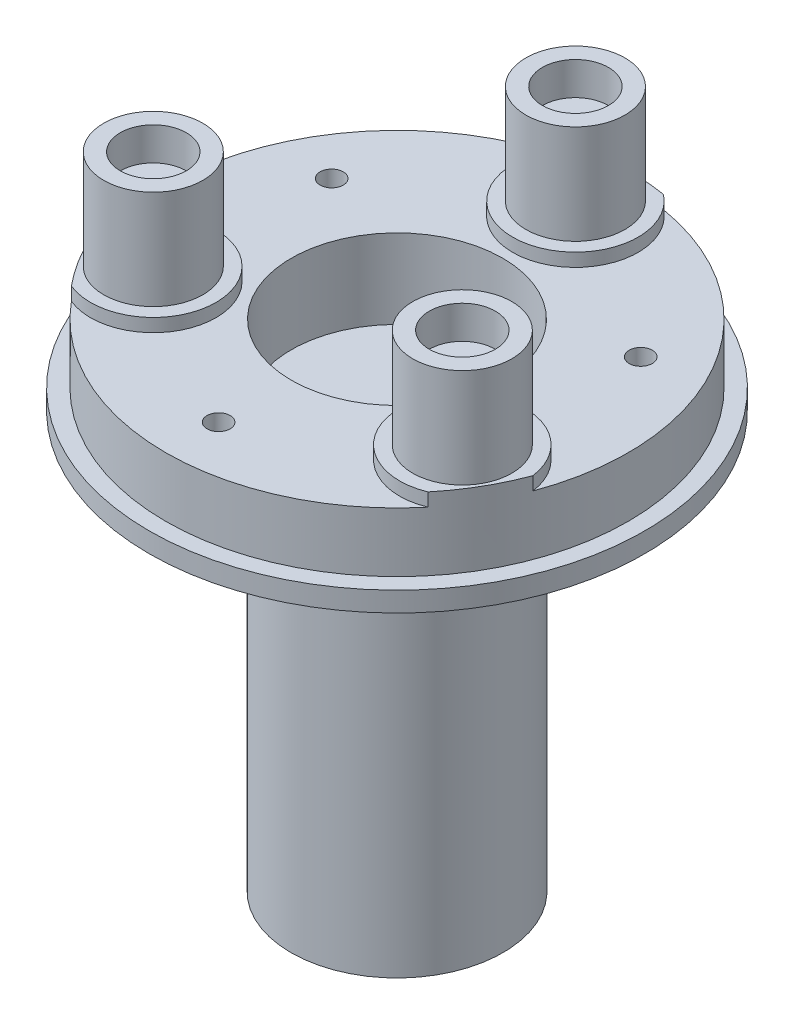
ISO-10303-21;
HEADER;
FILE_DESCRIPTION(('STEP AP214'),'2;1');
FILE_NAME('part.step','',(''),(''),'','','');
FILE_SCHEMA(('AUTOMOTIVE_DESIGN { 1 0 10303 214 1 1 1 1 }'));
ENDSEC;
DATA;
#1=APPLICATION_CONTEXT('core data for automotive mechanical design processes');
#2=APPLICATION_PROTOCOL_DEFINITION('international standard','automotive_design',2000,#1);
#3=PRODUCT_CONTEXT('',#1,'mechanical');
#4=PRODUCT('Part','Part','',(#3));
#5=PRODUCT_RELATED_PRODUCT_CATEGORY('part','',(#4));
#6=PRODUCT_DEFINITION_FORMATION('','',#4);
#7=PRODUCT_DEFINITION_CONTEXT('part definition',#1,'design');
#8=PRODUCT_DEFINITION('design','',#6,#7);
#9=PRODUCT_DEFINITION_SHAPE('','',#8);
#10=(LENGTH_UNIT() NAMED_UNIT(*) SI_UNIT(.MILLI.,.METRE.));
#11=(NAMED_UNIT(*) PLANE_ANGLE_UNIT() SI_UNIT($,.RADIAN.));
#12=(NAMED_UNIT(*) SI_UNIT($,.STERADIAN.) SOLID_ANGLE_UNIT());
#13=UNCERTAINTY_MEASURE_WITH_UNIT(LENGTH_MEASURE(1.E-05),#10,'distance_accuracy_value','');
#14=(GEOMETRIC_REPRESENTATION_CONTEXT(3) GLOBAL_UNCERTAINTY_ASSIGNED_CONTEXT((#13)) GLOBAL_UNIT_ASSIGNED_CONTEXT((#10,
#11,#12)) REPRESENTATION_CONTEXT('',''));
#15=CARTESIAN_POINT('',(0.,0.,0.));
#16=DIRECTION('',(0.,0.,1.));
#17=DIRECTION('',(1.,0.,0.));
#18=AXIS2_PLACEMENT_3D('',#15,#16,#17);
#19=CARTESIAN_POINT('',(0.,-63.,0.));
#20=DIRECTION('',(0.,1.,0.));
#21=DIRECTION('',(0.,0.,1.));
#22=AXIS2_PLACEMENT_3D('',#19,#20,#21);
#23=CYLINDRICAL_SURFACE('',#22,16.05);
#24=CARTESIAN_POINT('',(0.,-63.,0.));
#25=DIRECTION('',(0.,-1.,0.));
#26=DIRECTION('',(0.,0.,-1.));
#27=AXIS2_PLACEMENT_3D('',#24,#25,#26);
#28=CIRCLE('',#27,16.05);
#29=CARTESIAN_POINT('',(0.,-63.,-16.05));
#30=VERTEX_POINT('',#29);
#31=EDGE_CURVE('E11',#30,#30,#28,.T.);
#32=ORIENTED_EDGE('',*,*,#31,.F.);
#33=EDGE_LOOP('',(#32));
#34=FACE_BOUND('',#33,.T.);
#35=CARTESIAN_POINT('',(0.,0.,0.));
#36=DIRECTION('',(0.,-1.,0.));
#37=DIRECTION('',(0.,0.,-1.));
#38=AXIS2_PLACEMENT_3D('',#35,#36,#37);
#39=CIRCLE('',#38,16.05);
#40=CARTESIAN_POINT('',(0.,0.,-16.05));
#41=VERTEX_POINT('',#40);
#42=EDGE_CURVE('E48',#41,#41,#39,.T.);
#43=ORIENTED_EDGE('',*,*,#42,.T.);
#44=EDGE_LOOP('',(#43));
#45=FACE_BOUND('',#44,.T.);
#46=ADVANCED_FACE('F45',(#34,#45),#23,.T.);
#47=CARTESIAN_POINT('',(0.,-63.,0.));
#48=DIRECTION('',(0.,-1.,0.));
#49=DIRECTION('',(0.,0.,-1.));
#50=AXIS2_PLACEMENT_3D('',#47,#48,#49);
#51=PLANE('',#50);
#52=ORIENTED_EDGE('',*,*,#31,.T.);
#53=EDGE_LOOP('',(#52));
#54=FACE_BOUND('',#53,.T.);
#55=ADVANCED_FACE('F60',(#54),#51,.T.);
#56=CARTESIAN_POINT('',(0.,0.,0.));
#57=DIRECTION('',(0.,-1.,0.));
#58=DIRECTION('',(0.,0.,-1.));
#59=AXIS2_PLACEMENT_3D('',#56,#57,#58);
#60=PLANE('',#59);
#61=ORIENTED_EDGE('',*,*,#42,.F.);
#62=EDGE_LOOP('',(#61));
#63=FACE_BOUND('',#62,.T.);
#64=ADVANCED_FACE('F58',(#63),#60,.F.);
#65=CLOSED_SHELL('',(#46,#55,#64));
#66=MANIFOLD_SOLID_BREP('B2',#65);
#67=CARTESIAN_POINT('',(0.,3.,0.));
#68=DIRECTION('',(0.,-1.,0.));
#69=DIRECTION('',(0.,0.,-1.));
#70=AXIS2_PLACEMENT_3D('',#67,#68,#69);
#71=CYLINDRICAL_SURFACE('',#70,37.5);
#72=CARTESIAN_POINT('',(0.,3.,0.));
#73=DIRECTION('',(0.,1.,0.));
#74=DIRECTION('',(0.,0.,1.));
#75=AXIS2_PLACEMENT_3D('',#72,#73,#74);
#76=CIRCLE('',#75,37.5);
#77=CARTESIAN_POINT('',(0.,3.,37.5));
#78=VERTEX_POINT('',#77);
#79=EDGE_CURVE('E43',#78,#78,#76,.T.);
#80=ORIENTED_EDGE('',*,*,#79,.F.);
#81=EDGE_LOOP('',(#80));
#82=FACE_BOUND('',#81,.T.);
#83=CARTESIAN_POINT('',(0.,0.,0.));
#84=DIRECTION('',(0.,1.,0.));
#85=DIRECTION('',(0.,0.,1.));
#86=AXIS2_PLACEMENT_3D('',#83,#84,#85);
#87=CIRCLE('',#86,37.5);
#88=CARTESIAN_POINT('',(0.,0.,37.5));
#89=VERTEX_POINT('',#88);
#90=EDGE_CURVE('E94',#89,#89,#87,.T.);
#91=ORIENTED_EDGE('',*,*,#90,.T.);
#92=EDGE_LOOP('',(#91));
#93=FACE_BOUND('',#92,.T.);
#94=ADVANCED_FACE('F86',(#82,#93),#71,.T.);
#95=CARTESIAN_POINT('',(0.,3.,0.));
#96=DIRECTION('',(0.,1.,0.));
#97=DIRECTION('',(0.,0.,1.));
#98=AXIS2_PLACEMENT_3D('',#95,#96,#97);
#99=PLANE('',#98);
#100=CARTESIAN_POINT('',(0.,3.,0.));
#101=DIRECTION('',(0.,1.,0.));
#102=DIRECTION('',(0.,0.,1.));
#103=AXIS2_PLACEMENT_3D('',#100,#101,#102);
#104=CIRCLE('',#103,35.);
#105=CARTESIAN_POINT('',(0.,3.,35.));
#106=VERTEX_POINT('',#105);
#107=EDGE_CURVE('E195',#106,#106,#104,.F.);
#108=ORIENTED_EDGE('',*,*,#107,.T.);
#109=EDGE_LOOP('',(#108));
#110=FACE_BOUND('',#109,.T.);
#111=ORIENTED_EDGE('',*,*,#79,.T.);
#112=EDGE_LOOP('',(#111));
#113=FACE_BOUND('',#112,.T.);
#114=ADVANCED_FACE('F289',(#110,#113),#99,.T.);
#115=CARTESIAN_POINT('',(0.,0.,0.));
#116=DIRECTION('',(0.,1.,0.));
#117=DIRECTION('',(0.,0.,1.));
#118=AXIS2_PLACEMENT_3D('',#115,#116,#117);
#119=PLANE('',#118);
#120=CARTESIAN_POINT('',(23.3826859021799,0.,-13.4999999999999));
#121=DIRECTION('',(0.,1.,0.));
#122=DIRECTION('',(0.,0.,1.));
#123=AXIS2_PLACEMENT_3D('',#120,#121,#122);
#124=CIRCLE('',#123,1.75);
#125=CARTESIAN_POINT('',(23.3826859021799,0.,-11.7499999999999));
#126=VERTEX_POINT('',#125);
#127=EDGE_CURVE('E653',#126,#126,#124,.T.);
#128=ORIENTED_EDGE('',*,*,#127,.T.);
#129=EDGE_LOOP('',(#128));
#130=FACE_BOUND('',#129,.T.);
#131=CARTESIAN_POINT('',(1.62490074036202E-12,0.,27.000000000001));
#132=DIRECTION('',(0.,1.,0.));
#133=DIRECTION('',(0.,0.,1.));
#134=AXIS2_PLACEMENT_3D('',#131,#132,#133);
#135=CIRCLE('',#134,1.75);
#136=CARTESIAN_POINT('',(1.62490074036202E-12,0.,28.750000000001));
#137=VERTEX_POINT('',#136);
#138=EDGE_CURVE('E657',#137,#137,#135,.T.);
#139=ORIENTED_EDGE('',*,*,#138,.T.);
#140=EDGE_LOOP('',(#139));
#141=FACE_BOUND('',#140,.T.);
#142=CARTESIAN_POINT('',(-23.3826859021798,0.,-13.4999999999981));
#143=DIRECTION('',(0.,1.,0.));
#144=DIRECTION('',(0.,0.,1.));
#145=AXIS2_PLACEMENT_3D('',#142,#143,#144);
#146=CIRCLE('',#145,1.75);
#147=CARTESIAN_POINT('',(-23.3826859021798,0.,-11.7499999999981));
#148=VERTEX_POINT('',#147);
#149=EDGE_CURVE('E667',#148,#148,#146,.T.);
#150=ORIENTED_EDGE('',*,*,#149,.T.);
#151=EDGE_LOOP('',(#150));
#152=FACE_BOUND('',#151,.T.);
#153=CARTESIAN_POINT('',(0.,0.,-27.));
#154=DIRECTION('',(0.,-1.,0.));
#155=DIRECTION('',(0.,0.,-1.));
#156=AXIS2_PLACEMENT_3D('',#153,#154,#155);
#157=CIRCLE('',#156,3.525);
#158=CARTESIAN_POINT('',(0.,0.,-30.525));
#159=VERTEX_POINT('',#158);
#160=EDGE_CURVE('E659',#159,#159,#157,.T.);
#161=ORIENTED_EDGE('',*,*,#160,.F.);
#162=EDGE_LOOP('',(#161));
#163=FACE_BOUND('',#162,.T.);
#164=CARTESIAN_POINT('',(-23.3826859021816,0.,13.499999999999));
#165=DIRECTION('',(0.,-1.,0.));
#166=DIRECTION('',(0.,0.,-1.));
#167=AXIS2_PLACEMENT_3D('',#164,#165,#166);
#168=CIRCLE('',#167,3.525);
#169=CARTESIAN_POINT('',(-23.3826859021816,0.,9.974999999999));
#170=VERTEX_POINT('',#169);
#171=EDGE_CURVE('E684',#170,#170,#168,.T.);
#172=ORIENTED_EDGE('',*,*,#171,.F.);
#173=EDGE_LOOP('',(#172));
#174=FACE_BOUND('',#173,.T.);
#175=CARTESIAN_POINT('',(23.3826859021781,0.,13.500000000001));
#176=DIRECTION('',(0.,-1.,0.));
#177=DIRECTION('',(0.,0.,-1.));
#178=AXIS2_PLACEMENT_3D('',#175,#176,#177);
#179=CIRCLE('',#178,3.525);
#180=CARTESIAN_POINT('',(23.3826859021781,0.,9.97500000000099));
#181=VERTEX_POINT('',#180);
#182=EDGE_CURVE('E206',#181,#181,#179,.T.);
#183=ORIENTED_EDGE('',*,*,#182,.F.);
#184=EDGE_LOOP('',(#183));
#185=FACE_BOUND('',#184,.T.);
#186=CARTESIAN_POINT('',(0.,0.,0.));
#187=DIRECTION('',(0.,1.,0.));
#188=DIRECTION('',(0.,0.,1.));
#189=AXIS2_PLACEMENT_3D('',#186,#187,#188);
#190=CIRCLE('',#189,16.);
#191=CARTESIAN_POINT('',(0.,0.,16.));
#192=VERTEX_POINT('',#191);
#193=EDGE_CURVE('E186',#192,#192,#190,.T.);
#194=ORIENTED_EDGE('',*,*,#193,.T.);
#195=EDGE_LOOP('',(#194));
#196=FACE_BOUND('',#195,.T.);
#197=ORIENTED_EDGE('',*,*,#90,.F.);
#198=EDGE_LOOP('',(#197));
#199=FACE_BOUND('',#198,.T.);
#200=ADVANCED_FACE('F294',(#130,#141,#152,#163,#174,#185,#196,#199),#119,.F.);
#201=CARTESIAN_POINT('',(0.,12.,0.));
#202=DIRECTION('',(0.,-1.,0.));
#203=DIRECTION('',(0.,0.,-1.));
#204=AXIS2_PLACEMENT_3D('',#201,#202,#203);
#205=CYLINDRICAL_SURFACE('',#204,35.);
#206=ORIENTED_EDGE('',*,*,#107,.F.);
#207=EDGE_LOOP('',(#206));
#208=FACE_BOUND('',#207,.T.);
#209=CARTESIAN_POINT('',(0.,12.,0.));
#210=DIRECTION('',(0.,1.,0.));
#211=DIRECTION('',(0.,0.,1.));
#212=AXIS2_PLACEMENT_3D('',#209,#210,#211);
#213=CIRCLE('',#212,35.);
#214=CARTESIAN_POINT('',(-26.9833828527782,12.,22.291187716683));
#215=VERTEX_POINT('',#214);
#216=CARTESIAN_POINT('',(26.983382852779,12.,22.291187716682));
#217=VERTEX_POINT('',#216);
#218=EDGE_CURVE('E192',#215,#217,#213,.T.);
#219=ORIENTED_EDGE('',*,*,#218,.F.);
#220=DIRECTION('',(0.,-1.,0.));
#221=VECTOR('',#220,1.);
#222=CARTESIAN_POINT('',(-26.9833828527782,14.,22.291187716683));
#223=LINE('',#222,#221);
#224=CARTESIAN_POINT('',(-26.9833828527782,14.,22.291187716683));
#225=VERTEX_POINT('',#224);
#226=EDGE_CURVE('E182',#225,#215,#223,.T.);
#227=ORIENTED_EDGE('',*,*,#226,.F.);
#228=CARTESIAN_POINT('',(0.,14.,0.));
#229=DIRECTION('',(0.,1.,0.));
#230=DIRECTION('',(0.,0.,1.));
#231=AXIS2_PLACEMENT_3D('',#228,#229,#230);
#232=CIRCLE('',#231,35.);
#233=CARTESIAN_POINT('',(-32.7964262695624,14.,12.2227011722105));
#234=VERTEX_POINT('',#233);
#235=EDGE_CURVE('E172',#234,#225,#232,.T.);
#236=ORIENTED_EDGE('',*,*,#235,.F.);
#237=DIRECTION('',(0.,-1.,0.));
#238=VECTOR('',#237,1.);
#239=CARTESIAN_POINT('',(-32.7964262695624,14.,12.2227011722105));
#240=LINE('',#239,#238);
#241=CARTESIAN_POINT('',(-32.7964262695624,12.,12.2227011722105));
#242=VERTEX_POINT('',#241);
#243=EDGE_CURVE('E177',#234,#242,#240,.T.);
#244=ORIENTED_EDGE('',*,*,#243,.T.);
#245=CARTESIAN_POINT('',(-5.81304341678534,12.,-34.5138888888889));
#246=VERTEX_POINT('',#245);
#247=EDGE_CURVE('E189',#246,#242,#213,.T.);
#248=ORIENTED_EDGE('',*,*,#247,.F.);
#249=DIRECTION('',(0.,-1.,0.));
#250=VECTOR('',#249,1.);
#251=CARTESIAN_POINT('',(-5.81304341678534,14.,-34.5138888888889));
#252=LINE('',#251,#250);
#253=CARTESIAN_POINT('',(-5.81304341678534,14.,-34.5138888888889));
#254=VERTEX_POINT('',#253);
#255=EDGE_CURVE('E110',#254,#246,#252,.T.);
#256=ORIENTED_EDGE('',*,*,#255,.F.);
#257=CARTESIAN_POINT('',(0.,14.,0.));
#258=DIRECTION('',(0.,1.,0.));
#259=DIRECTION('',(0.,0.,1.));
#260=AXIS2_PLACEMENT_3D('',#257,#258,#259);
#261=CIRCLE('',#260,35.);
#262=CARTESIAN_POINT('',(5.81304341678534,14.,-34.5138888888889));
#263=VERTEX_POINT('',#262);
#264=EDGE_CURVE('E159',#263,#254,#261,.T.);
#265=ORIENTED_EDGE('',*,*,#264,.F.);
#266=DIRECTION('',(0.,-1.,0.));
#267=VECTOR('',#266,1.);
#268=CARTESIAN_POINT('',(5.81304341678534,14.,-34.5138888888889));
#269=LINE('',#268,#267);
#270=CARTESIAN_POINT('',(5.81304341678534,12.,-34.5138888888889));
#271=VERTEX_POINT('',#270);
#272=EDGE_CURVE('E167',#263,#271,#269,.T.);
#273=ORIENTED_EDGE('',*,*,#272,.T.);
#274=CARTESIAN_POINT('',(32.7964262695655,12.,12.2227011722024));
#275=VERTEX_POINT('',#274);
#276=EDGE_CURVE('E156',#275,#271,#213,.T.);
#277=ORIENTED_EDGE('',*,*,#276,.F.);
#278=DIRECTION('',(0.,-1.,0.));
#279=VECTOR('',#278,1.);
#280=CARTESIAN_POINT('',(32.7964262695655,14.,12.2227011722024));
#281=LINE('',#280,#279);
#282=CARTESIAN_POINT('',(32.7964262695655,14.,12.2227011722024));
#283=VERTEX_POINT('',#282);
#284=EDGE_CURVE('E102',#283,#275,#281,.T.);
#285=ORIENTED_EDGE('',*,*,#284,.F.);
#286=CARTESIAN_POINT('',(0.,14.,0.));
#287=DIRECTION('',(0.,1.,0.));
#288=DIRECTION('',(0.,0.,1.));
#289=AXIS2_PLACEMENT_3D('',#286,#287,#288);
#290=CIRCLE('',#289,35.);
#291=CARTESIAN_POINT('',(26.983382852779,14.,22.291187716682));
#292=VERTEX_POINT('',#291);
#293=EDGE_CURVE('E146',#292,#283,#290,.T.);
#294=ORIENTED_EDGE('',*,*,#293,.F.);
#295=DIRECTION('',(0.,-1.,0.));
#296=VECTOR('',#295,1.);
#297=CARTESIAN_POINT('',(26.983382852779,14.,22.291187716682));
#298=LINE('',#297,#296);
#299=EDGE_CURVE('E143',#292,#217,#298,.T.);
#300=ORIENTED_EDGE('',*,*,#299,.T.);
#301=EDGE_LOOP('',(#219,#227,#236,#244,#248,#256,#265,#273,#277,#285,#294,#300));
#302=FACE_BOUND('',#301,.T.);
#303=ADVANCED_FACE('F154',(#208,#302),#205,.T.);
#304=CARTESIAN_POINT('',(0.,12.,0.));
#305=DIRECTION('',(0.,1.,0.));
#306=DIRECTION('',(0.,0.,1.));
#307=AXIS2_PLACEMENT_3D('',#304,#305,#306);
#308=PLANE('',#307);
#309=CARTESIAN_POINT('',(23.3826859021799,12.,-13.4999999999999));
#310=DIRECTION('',(0.,1.,0.));
#311=DIRECTION('',(0.,0.,1.));
#312=AXIS2_PLACEMENT_3D('',#309,#310,#311);
#313=CIRCLE('',#312,1.75);
#314=CARTESIAN_POINT('',(23.3826859021799,12.,-11.7499999999999));
#315=VERTEX_POINT('',#314);
#316=EDGE_CURVE('E656',#315,#315,#313,.T.);
#317=ORIENTED_EDGE('',*,*,#316,.F.);
#318=EDGE_LOOP('',(#317));
#319=FACE_BOUND('',#318,.T.);
#320=CARTESIAN_POINT('',(1.62490074036202E-12,12.,27.000000000001));
#321=DIRECTION('',(0.,1.,0.));
#322=DIRECTION('',(0.,0.,1.));
#323=AXIS2_PLACEMENT_3D('',#320,#321,#322);
#324=CIRCLE('',#323,1.75);
#325=CARTESIAN_POINT('',(1.62490074036202E-12,12.,28.750000000001));
#326=VERTEX_POINT('',#325);
#327=EDGE_CURVE('E662',#326,#326,#324,.T.);
#328=ORIENTED_EDGE('',*,*,#327,.F.);
#329=EDGE_LOOP('',(#328));
#330=FACE_BOUND('',#329,.T.);
#331=CARTESIAN_POINT('',(-23.3826859021798,12.,-13.4999999999981));
#332=DIRECTION('',(0.,1.,0.));
#333=DIRECTION('',(0.,0.,1.));
#334=AXIS2_PLACEMENT_3D('',#331,#332,#333);
#335=CIRCLE('',#334,1.75);
#336=CARTESIAN_POINT('',(-23.3826859021798,12.,-11.7499999999981));
#337=VERTEX_POINT('',#336);
#338=EDGE_CURVE('E670',#337,#337,#335,.T.);
#339=ORIENTED_EDGE('',*,*,#338,.F.);
#340=EDGE_LOOP('',(#339));
#341=FACE_BOUND('',#340,.T.);
#342=ORIENTED_EDGE('',*,*,#218,.T.);
#343=CARTESIAN_POINT('',(23.3826859021818,12.,13.4999999999989));
#344=DIRECTION('',(0.,1.,0.));
#345=DIRECTION('',(0.,0.,1.));
#346=AXIS2_PLACEMENT_3D('',#343,#344,#345);
#347=CIRCLE('',#346,9.5);
#348=EDGE_CURVE('E150',#275,#217,#347,.T.);
#349=ORIENTED_EDGE('',*,*,#348,.F.);
#350=ORIENTED_EDGE('',*,*,#276,.T.);
#351=CARTESIAN_POINT('',(0.,12.,-27.));
#352=DIRECTION('',(0.,1.,0.));
#353=DIRECTION('',(0.,0.,1.));
#354=AXIS2_PLACEMENT_3D('',#351,#352,#353);
#355=CIRCLE('',#354,9.5);
#356=EDGE_CURVE('E157',#246,#271,#355,.T.);
#357=ORIENTED_EDGE('',*,*,#356,.F.);
#358=ORIENTED_EDGE('',*,*,#247,.T.);
#359=CARTESIAN_POINT('',(-23.3826859021779,12.,13.5000000000011));
#360=DIRECTION('',(0.,1.,0.));
#361=DIRECTION('',(0.,0.,1.));
#362=AXIS2_PLACEMENT_3D('',#359,#360,#361);
#363=CIRCLE('',#362,9.50000000000001);
#364=EDGE_CURVE('E171',#215,#242,#363,.T.);
#365=ORIENTED_EDGE('',*,*,#364,.F.);
#366=EDGE_LOOP('',(#342,#349,#350,#357,#358,#365));
#367=FACE_BOUND('',#366,.T.);
#368=CARTESIAN_POINT('',(0.,12.,0.));
#369=DIRECTION('',(0.,1.,0.));
#370=DIRECTION('',(0.,0.,1.));
#371=AXIS2_PLACEMENT_3D('',#368,#369,#370);
#372=CIRCLE('',#371,16.);
#373=CARTESIAN_POINT('',(0.,12.,16.));
#374=VERTEX_POINT('',#373);
#375=EDGE_CURVE('E185',#374,#374,#372,.T.);
#376=ORIENTED_EDGE('',*,*,#375,.F.);
#377=EDGE_LOOP('',(#376));
#378=FACE_BOUND('',#377,.T.);
#379=ADVANCED_FACE('F266',(#319,#330,#341,#367,#378),#308,.T.);
#380=CARTESIAN_POINT('',(0.,0.,0.));
#381=DIRECTION('',(0.,1.,0.));
#382=DIRECTION('',(0.,0.,1.));
#383=AXIS2_PLACEMENT_3D('',#380,#381,#382);
#384=CYLINDRICAL_SURFACE('',#383,16.);
#385=ORIENTED_EDGE('',*,*,#193,.F.);
#386=EDGE_LOOP('',(#385));
#387=FACE_BOUND('',#386,.T.);
#388=ORIENTED_EDGE('',*,*,#375,.T.);
#389=EDGE_LOOP('',(#388));
#390=FACE_BOUND('',#389,.T.);
#391=ADVANCED_FACE('F285',(#387,#390),#384,.F.);
#392=CARTESIAN_POINT('',(-23.3826859021779,14.,13.5000000000011));
#393=DIRECTION('',(0.,-1.,0.));
#394=DIRECTION('',(0.,0.,-1.));
#395=AXIS2_PLACEMENT_3D('',#392,#393,#394);
#396=CYLINDRICAL_SURFACE('',#395,9.50000000000001);
#397=ORIENTED_EDGE('',*,*,#364,.T.);
#398=ORIENTED_EDGE('',*,*,#243,.F.);
#399=CARTESIAN_POINT('',(-23.3826859021779,14.,13.5000000000011));
#400=DIRECTION('',(0.,1.,0.));
#401=DIRECTION('',(0.,0.,1.));
#402=AXIS2_PLACEMENT_3D('',#399,#400,#401);
#403=CIRCLE('',#402,9.50000000000001);
#404=EDGE_CURVE('E175',#225,#234,#403,.T.);
#405=ORIENTED_EDGE('',*,*,#404,.F.);
#406=ORIENTED_EDGE('',*,*,#226,.T.);
#407=EDGE_LOOP('',(#397,#398,#405,#406));
#408=FACE_BOUND('',#407,.T.);
#409=ADVANCED_FACE('F271',(#408),#396,.T.);
#410=CARTESIAN_POINT('',(0.,14.,0.));
#411=DIRECTION('',(0.,1.,0.));
#412=DIRECTION('',(0.,0.,1.));
#413=AXIS2_PLACEMENT_3D('',#410,#411,#412);
#414=PLANE('',#413);
#415=CARTESIAN_POINT('',(-23.3826859021781,14.,13.500000000001));
#416=DIRECTION('',(0.,1.,0.));
#417=DIRECTION('',(0.,0.,1.));
#418=AXIS2_PLACEMENT_3D('',#415,#416,#417);
#419=CIRCLE('',#418,7.50000000000218);
#420=CARTESIAN_POINT('',(-23.3826859021781,14.,21.0000000000032));
#421=VERTEX_POINT('',#420);
#422=EDGE_CURVE('E233',#421,#421,#419,.T.);
#423=ORIENTED_EDGE('',*,*,#422,.F.);
#424=EDGE_LOOP('',(#423));
#425=FACE_BOUND('',#424,.T.);
#426=ORIENTED_EDGE('',*,*,#235,.T.);
#427=ORIENTED_EDGE('',*,*,#404,.T.);
#428=EDGE_LOOP('',(#426,#427));
#429=FACE_BOUND('',#428,.T.);
#430=ADVANCED_FACE('F274',(#425,#429),#414,.T.);
#431=CARTESIAN_POINT('',(0.,14.,-27.));
#432=DIRECTION('',(0.,-1.,0.));
#433=DIRECTION('',(0.,0.,-1.));
#434=AXIS2_PLACEMENT_3D('',#431,#432,#433);
#435=CYLINDRICAL_SURFACE('',#434,9.5);
#436=ORIENTED_EDGE('',*,*,#356,.T.);
#437=ORIENTED_EDGE('',*,*,#272,.F.);
#438=CARTESIAN_POINT('',(0.,14.,-27.));
#439=DIRECTION('',(0.,1.,0.));
#440=DIRECTION('',(0.,0.,1.));
#441=AXIS2_PLACEMENT_3D('',#438,#439,#440);
#442=CIRCLE('',#441,9.5);
#443=EDGE_CURVE('E166',#254,#263,#442,.T.);
#444=ORIENTED_EDGE('',*,*,#443,.F.);
#445=ORIENTED_EDGE('',*,*,#255,.T.);
#446=EDGE_LOOP('',(#436,#437,#444,#445));
#447=FACE_BOUND('',#446,.T.);
#448=ADVANCED_FACE('F276',(#447),#435,.T.);
#449=CARTESIAN_POINT('',(0.,14.,0.));
#450=DIRECTION('',(0.,1.,0.));
#451=DIRECTION('',(0.,0.,1.));
#452=AXIS2_PLACEMENT_3D('',#449,#450,#451);
#453=PLANE('',#452);
#454=CARTESIAN_POINT('',(0.,14.,-27.));
#455=DIRECTION('',(0.,1.,0.));
#456=DIRECTION('',(0.,0.,1.));
#457=AXIS2_PLACEMENT_3D('',#454,#455,#456);
#458=CIRCLE('',#457,7.5);
#459=CARTESIAN_POINT('',(0.,14.,-19.5));
#460=VERTEX_POINT('',#459);
#461=EDGE_CURVE('E257',#460,#460,#458,.T.);
#462=ORIENTED_EDGE('',*,*,#461,.F.);
#463=EDGE_LOOP('',(#462));
#464=FACE_BOUND('',#463,.T.);
#465=ORIENTED_EDGE('',*,*,#264,.T.);
#466=ORIENTED_EDGE('',*,*,#443,.T.);
#467=EDGE_LOOP('',(#465,#466));
#468=FACE_BOUND('',#467,.T.);
#469=ADVANCED_FACE('F283',(#464,#468),#453,.T.);
#470=CARTESIAN_POINT('',(23.3826859021818,14.,13.4999999999989));
#471=DIRECTION('',(0.,-1.,0.));
#472=DIRECTION('',(0.,0.,-1.));
#473=AXIS2_PLACEMENT_3D('',#470,#471,#472);
#474=CYLINDRICAL_SURFACE('',#473,9.5);
#475=ORIENTED_EDGE('',*,*,#348,.T.);
#476=ORIENTED_EDGE('',*,*,#299,.F.);
#477=CARTESIAN_POINT('',(23.3826859021818,14.,13.4999999999989));
#478=DIRECTION('',(0.,1.,0.));
#479=DIRECTION('',(0.,0.,1.));
#480=AXIS2_PLACEMENT_3D('',#477,#478,#479);
#481=CIRCLE('',#480,9.5);
#482=EDGE_CURVE('E139',#283,#292,#481,.T.);
#483=ORIENTED_EDGE('',*,*,#482,.F.);
#484=ORIENTED_EDGE('',*,*,#284,.T.);
#485=EDGE_LOOP('',(#475,#476,#483,#484));
#486=FACE_BOUND('',#485,.T.);
#487=ADVANCED_FACE('F141',(#486),#474,.T.);
#488=CARTESIAN_POINT('',(0.,14.,0.));
#489=DIRECTION('',(0.,1.,0.));
#490=DIRECTION('',(0.,0.,1.));
#491=AXIS2_PLACEMENT_3D('',#488,#489,#490);
#492=PLANE('',#491);
#493=CARTESIAN_POINT('',(23.3826859021816,14.,13.499999999999));
#494=DIRECTION('',(0.,1.,0.));
#495=DIRECTION('',(0.,0.,1.));
#496=AXIS2_PLACEMENT_3D('',#493,#494,#495);
#497=CIRCLE('',#496,7.50000000000147);
#498=CARTESIAN_POINT('',(23.3826859021816,14.,21.0000000000005));
#499=VERTEX_POINT('',#498);
#500=EDGE_CURVE('E251',#499,#499,#497,.T.);
#501=ORIENTED_EDGE('',*,*,#500,.F.);
#502=EDGE_LOOP('',(#501));
#503=FACE_BOUND('',#502,.T.);
#504=ORIENTED_EDGE('',*,*,#293,.T.);
#505=ORIENTED_EDGE('',*,*,#482,.T.);
#506=EDGE_LOOP('',(#504,#505));
#507=FACE_BOUND('',#506,.T.);
#508=ADVANCED_FACE('F148',(#503,#507),#492,.T.);
#509=CARTESIAN_POINT('',(0.,29.,-27.));
#510=DIRECTION('',(0.,-1.,0.));
#511=DIRECTION('',(0.,0.,-1.));
#512=AXIS2_PLACEMENT_3D('',#509,#510,#511);
#513=CYLINDRICAL_SURFACE('',#512,7.5);
#514=CARTESIAN_POINT('',(0.,29.,-27.));
#515=DIRECTION('',(0.,1.,0.));
#516=DIRECTION('',(0.,0.,1.));
#517=AXIS2_PLACEMENT_3D('',#514,#515,#516);
#518=CIRCLE('',#517,7.5);
#519=CARTESIAN_POINT('',(0.,29.,-19.5));
#520=VERTEX_POINT('',#519);
#521=EDGE_CURVE('E260',#520,#520,#518,.T.);
#522=ORIENTED_EDGE('',*,*,#521,.F.);
#523=EDGE_LOOP('',(#522));
#524=FACE_BOUND('',#523,.T.);
#525=ORIENTED_EDGE('',*,*,#461,.T.);
#526=EDGE_LOOP('',(#525));
#527=FACE_BOUND('',#526,.T.);
#528=ADVANCED_FACE('F368',(#524,#527),#513,.T.);
#529=CARTESIAN_POINT('',(0.,29.,-27.));
#530=DIRECTION('',(0.,1.,0.));
#531=DIRECTION('',(0.,0.,1.));
#532=AXIS2_PLACEMENT_3D('',#529,#530,#531);
#533=PLANE('',#532);
#534=CARTESIAN_POINT('',(0.,29.,-27.));
#535=DIRECTION('',(0.,1.,0.));
#536=DIRECTION('',(0.,0.,1.));
#537=AXIS2_PLACEMENT_3D('',#534,#535,#536);
#538=CIRCLE('',#537,5.);
#539=CARTESIAN_POINT('',(0.,29.,-22.));
#540=VERTEX_POINT('',#539);
#541=EDGE_CURVE('E234',#540,#540,#538,.T.);
#542=ORIENTED_EDGE('',*,*,#541,.F.);
#543=EDGE_LOOP('',(#542));
#544=FACE_BOUND('',#543,.T.);
#545=ORIENTED_EDGE('',*,*,#521,.T.);
#546=EDGE_LOOP('',(#545));
#547=FACE_BOUND('',#546,.T.);
#548=ADVANCED_FACE('F378',(#544,#547),#533,.T.);
#549=CARTESIAN_POINT('',(23.3826859021816,29.,13.499999999999));
#550=DIRECTION('',(0.,-1.,0.));
#551=DIRECTION('',(0.,0.,-1.));
#552=AXIS2_PLACEMENT_3D('',#549,#550,#551);
#553=CYLINDRICAL_SURFACE('',#552,7.50000000000147);
#554=CARTESIAN_POINT('',(23.3826859021816,29.,13.499999999999));
#555=DIRECTION('',(0.,1.,0.));
#556=DIRECTION('',(0.,0.,1.));
#557=AXIS2_PLACEMENT_3D('',#554,#555,#556);
#558=CIRCLE('',#557,7.50000000000147);
#559=CARTESIAN_POINT('',(23.3826859021816,29.,21.0000000000005));
#560=VERTEX_POINT('',#559);
#561=EDGE_CURVE('E254',#560,#560,#558,.T.);
#562=ORIENTED_EDGE('',*,*,#561,.F.);
#563=EDGE_LOOP('',(#562));
#564=FACE_BOUND('',#563,.T.);
#565=ORIENTED_EDGE('',*,*,#500,.T.);
#566=EDGE_LOOP('',(#565));
#567=FACE_BOUND('',#566,.T.);
#568=ADVANCED_FACE('F386',(#564,#567),#553,.T.);
#569=CARTESIAN_POINT('',(23.3826859021816,29.,13.499999999999));
#570=DIRECTION('',(0.,1.,0.));
#571=DIRECTION('',(0.,0.,1.));
#572=AXIS2_PLACEMENT_3D('',#569,#570,#571);
#573=PLANE('',#572);
#574=CARTESIAN_POINT('',(23.382685902181,29.,13.4999999999993));
#575=DIRECTION('',(0.,1.,0.));
#576=DIRECTION('',(0.,0.,1.));
#577=AXIS2_PLACEMENT_3D('',#574,#575,#576);
#578=CIRCLE('',#577,5.00000000000102);
#579=CARTESIAN_POINT('',(23.382685902181,29.,18.5000000000004));
#580=VERTEX_POINT('',#579);
#581=EDGE_CURVE('E240',#580,#580,#578,.T.);
#582=ORIENTED_EDGE('',*,*,#581,.F.);
#583=EDGE_LOOP('',(#582));
#584=FACE_BOUND('',#583,.T.);
#585=ORIENTED_EDGE('',*,*,#561,.T.);
#586=EDGE_LOOP('',(#585));
#587=FACE_BOUND('',#586,.T.);
#588=ADVANCED_FACE('F391',(#584,#587),#573,.T.);
#589=CARTESIAN_POINT('',(-23.3826859021781,29.,13.500000000001));
#590=DIRECTION('',(0.,-1.,0.));
#591=DIRECTION('',(0.,0.,-1.));
#592=AXIS2_PLACEMENT_3D('',#589,#590,#591);
#593=CYLINDRICAL_SURFACE('',#592,7.50000000000218);
#594=CARTESIAN_POINT('',(-23.3826859021781,29.,13.500000000001));
#595=DIRECTION('',(0.,1.,0.));
#596=DIRECTION('',(0.,0.,1.));
#597=AXIS2_PLACEMENT_3D('',#594,#595,#596);
#598=CIRCLE('',#597,7.50000000000218);
#599=CARTESIAN_POINT('',(-23.3826859021781,29.,21.0000000000032));
#600=VERTEX_POINT('',#599);
#601=EDGE_CURVE('E248',#600,#600,#598,.T.);
#602=ORIENTED_EDGE('',*,*,#601,.F.);
#603=EDGE_LOOP('',(#602));
#604=FACE_BOUND('',#603,.T.);
#605=ORIENTED_EDGE('',*,*,#422,.T.);
#606=EDGE_LOOP('',(#605));
#607=FACE_BOUND('',#606,.T.);
#608=ADVANCED_FACE('F399',(#604,#607),#593,.T.);
#609=CARTESIAN_POINT('',(-23.3826859021781,29.,13.500000000001));
#610=DIRECTION('',(0.,1.,0.));
#611=DIRECTION('',(0.,0.,1.));
#612=AXIS2_PLACEMENT_3D('',#609,#610,#611);
#613=PLANE('',#612);
#614=CARTESIAN_POINT('',(-23.3826859021787,29.,13.5000000000007));
#615=DIRECTION('',(0.,1.,0.));
#616=DIRECTION('',(0.,0.,1.));
#617=AXIS2_PLACEMENT_3D('',#614,#615,#616);
#618=CIRCLE('',#617,5.00000000000154);
#619=CARTESIAN_POINT('',(-23.3826859021787,29.,18.5000000000022));
#620=VERTEX_POINT('',#619);
#621=EDGE_CURVE('E202',#620,#620,#618,.T.);
#622=ORIENTED_EDGE('',*,*,#621,.F.);
#623=EDGE_LOOP('',(#622));
#624=FACE_BOUND('',#623,.T.);
#625=ORIENTED_EDGE('',*,*,#601,.T.);
#626=EDGE_LOOP('',(#625));
#627=FACE_BOUND('',#626,.T.);
#628=ADVANCED_FACE('F404',(#624,#627),#613,.T.);
#629=CARTESIAN_POINT('',(-23.3826859021787,24.,13.5000000000007));
#630=DIRECTION('',(0.,1.,0.));
#631=DIRECTION('',(0.,0.,1.));
#632=AXIS2_PLACEMENT_3D('',#629,#630,#631);
#633=CYLINDRICAL_SURFACE('',#632,5.00000000000154);
#634=CARTESIAN_POINT('',(-23.3826859021787,24.,13.5000000000007));
#635=DIRECTION('',(0.,1.,0.));
#636=DIRECTION('',(0.,0.,1.));
#637=AXIS2_PLACEMENT_3D('',#634,#635,#636);
#638=CIRCLE('',#637,5.00000000000154);
#639=CARTESIAN_POINT('',(-23.3826859021787,24.,18.5000000000022));
#640=VERTEX_POINT('',#639);
#641=EDGE_CURVE('E243',#640,#640,#638,.T.);
#642=ORIENTED_EDGE('',*,*,#641,.F.);
#643=EDGE_LOOP('',(#642));
#644=FACE_BOUND('',#643,.T.);
#645=ORIENTED_EDGE('',*,*,#621,.T.);
#646=EDGE_LOOP('',(#645));
#647=FACE_BOUND('',#646,.T.);
#648=ADVANCED_FACE('F428',(#644,#647),#633,.F.);
#649=CARTESIAN_POINT('',(-23.3826859021787,24.,13.5000000000007));
#650=DIRECTION('',(0.,1.,0.));
#651=DIRECTION('',(0.,0.,1.));
#652=AXIS2_PLACEMENT_3D('',#649,#650,#651);
#653=PLANE('',#652);
#654=CARTESIAN_POINT('',(-23.3826859021816,24.,13.499999999999));
#655=DIRECTION('',(0.,1.,0.));
#656=DIRECTION('',(0.,0.,1.));
#657=AXIS2_PLACEMENT_3D('',#654,#655,#656);
#658=CIRCLE('',#657,1.8);
#659=CARTESIAN_POINT('',(-23.3826859021816,24.,15.299999999999));
#660=VERTEX_POINT('',#659);
#661=EDGE_CURVE('E204',#660,#660,#658,.T.);
#662=ORIENTED_EDGE('',*,*,#661,.F.);
#663=EDGE_LOOP('',(#662));
#664=FACE_BOUND('',#663,.T.);
#665=ORIENTED_EDGE('',*,*,#641,.T.);
#666=EDGE_LOOP('',(#665));
#667=FACE_BOUND('',#666,.T.);
#668=ADVANCED_FACE('F438',(#664,#667),#653,.T.);
#669=CARTESIAN_POINT('',(23.382685902181,24.,13.4999999999993));
#670=DIRECTION('',(0.,1.,0.));
#671=DIRECTION('',(0.,0.,1.));
#672=AXIS2_PLACEMENT_3D('',#669,#670,#671);
#673=CYLINDRICAL_SURFACE('',#672,5.00000000000102);
#674=CARTESIAN_POINT('',(23.382685902181,24.,13.4999999999993));
#675=DIRECTION('',(0.,1.,0.));
#676=DIRECTION('',(0.,0.,1.));
#677=AXIS2_PLACEMENT_3D('',#674,#675,#676);
#678=CIRCLE('',#677,5.00000000000102);
#679=CARTESIAN_POINT('',(23.382685902181,24.,18.5000000000004));
#680=VERTEX_POINT('',#679);
#681=EDGE_CURVE('E237',#680,#680,#678,.T.);
#682=ORIENTED_EDGE('',*,*,#681,.F.);
#683=EDGE_LOOP('',(#682));
#684=FACE_BOUND('',#683,.T.);
#685=ORIENTED_EDGE('',*,*,#581,.T.);
#686=EDGE_LOOP('',(#685));
#687=FACE_BOUND('',#686,.T.);
#688=ADVANCED_FACE('F446',(#684,#687),#673,.F.);
#689=CARTESIAN_POINT('',(23.382685902181,24.,13.4999999999993));
#690=DIRECTION('',(0.,1.,0.));
#691=DIRECTION('',(0.,0.,1.));
#692=AXIS2_PLACEMENT_3D('',#689,#690,#691);
#693=PLANE('',#692);
#694=CARTESIAN_POINT('',(23.3826859021781,24.,13.500000000001));
#695=DIRECTION('',(0.,1.,0.));
#696=DIRECTION('',(0.,0.,1.));
#697=AXIS2_PLACEMENT_3D('',#694,#695,#696);
#698=CIRCLE('',#697,1.8);
#699=CARTESIAN_POINT('',(23.3826859021781,24.,15.300000000001));
#700=VERTEX_POINT('',#699);
#701=EDGE_CURVE('E200',#700,#700,#698,.T.);
#702=ORIENTED_EDGE('',*,*,#701,.F.);
#703=EDGE_LOOP('',(#702));
#704=FACE_BOUND('',#703,.T.);
#705=ORIENTED_EDGE('',*,*,#681,.T.);
#706=EDGE_LOOP('',(#705));
#707=FACE_BOUND('',#706,.T.);
#708=ADVANCED_FACE('F451',(#704,#707),#693,.T.);
#709=CARTESIAN_POINT('',(0.,24.,-27.));
#710=DIRECTION('',(0.,1.,0.));
#711=DIRECTION('',(0.,0.,1.));
#712=AXIS2_PLACEMENT_3D('',#709,#710,#711);
#713=CYLINDRICAL_SURFACE('',#712,5.);
#714=CARTESIAN_POINT('',(0.,24.,-27.));
#715=DIRECTION('',(0.,1.,0.));
#716=DIRECTION('',(0.,0.,1.));
#717=AXIS2_PLACEMENT_3D('',#714,#715,#716);
#718=CIRCLE('',#717,5.);
#719=CARTESIAN_POINT('',(0.,24.,-22.));
#720=VERTEX_POINT('',#719);
#721=EDGE_CURVE('E230',#720,#720,#718,.T.);
#722=ORIENTED_EDGE('',*,*,#721,.F.);
#723=EDGE_LOOP('',(#722));
#724=FACE_BOUND('',#723,.T.);
#725=ORIENTED_EDGE('',*,*,#541,.T.);
#726=EDGE_LOOP('',(#725));
#727=FACE_BOUND('',#726,.T.);
#728=ADVANCED_FACE('F459',(#724,#727),#713,.F.);
#729=CARTESIAN_POINT('',(0.,24.,-27.));
#730=DIRECTION('',(0.,1.,0.));
#731=DIRECTION('',(0.,0.,1.));
#732=AXIS2_PLACEMENT_3D('',#729,#730,#731);
#733=PLANE('',#732);
#734=CARTESIAN_POINT('',(0.,24.,-27.));
#735=DIRECTION('',(0.,1.,0.));
#736=DIRECTION('',(0.,0.,1.));
#737=AXIS2_PLACEMENT_3D('',#734,#735,#736);
#738=CIRCLE('',#737,1.8);
#739=CARTESIAN_POINT('',(0.,24.,-25.2));
#740=VERTEX_POINT('',#739);
#741=EDGE_CURVE('E89',#740,#740,#738,.T.);
#742=ORIENTED_EDGE('',*,*,#741,.F.);
#743=EDGE_LOOP('',(#742));
#744=FACE_BOUND('',#743,.T.);
#745=ORIENTED_EDGE('',*,*,#721,.T.);
#746=EDGE_LOOP('',(#745));
#747=FACE_BOUND('',#746,.T.);
#748=ADVANCED_FACE('F464',(#744,#747),#733,.T.);
#749=CARTESIAN_POINT('',(23.3826859021781,0.,13.500000000001));
#750=DIRECTION('',(0.,-1.,0.));
#751=DIRECTION('',(0.,0.,-1.));
#752=AXIS2_PLACEMENT_3D('',#749,#750,#751);
#753=CYLINDRICAL_SURFACE('',#752,1.8);
#754=ORIENTED_EDGE('',*,*,#701,.T.);
#755=EDGE_LOOP('',(#754));
#756=FACE_BOUND('',#755,.T.);
#757=CARTESIAN_POINT('',(23.3826859021781,2.4,13.500000000001));
#758=DIRECTION('',(0.,-1.,0.));
#759=DIRECTION('',(0.,0.,-1.));
#760=AXIS2_PLACEMENT_3D('',#757,#758,#759);
#761=CIRCLE('',#760,1.8);
#762=CARTESIAN_POINT('',(23.3826859021781,2.4,11.700000000001));
#763=VERTEX_POINT('',#762);
#764=EDGE_CURVE('E203',#763,#763,#761,.T.);
#765=ORIENTED_EDGE('',*,*,#764,.T.);
#766=EDGE_LOOP('',(#765));
#767=FACE_BOUND('',#766,.T.);
#768=ADVANCED_FACE('F488',(#756,#767),#753,.F.);
#769=CARTESIAN_POINT('',(26.8826859021781,2.4,13.500000000001));
#770=DIRECTION('',(0.,1.,0.));
#771=DIRECTION('',(0.,0.,1.));
#772=AXIS2_PLACEMENT_3D('',#769,#770,#771);
#773=PLANE('',#772);
#774=ORIENTED_EDGE('',*,*,#764,.F.);
#775=EDGE_LOOP('',(#774));
#776=FACE_BOUND('',#775,.T.);
#777=CARTESIAN_POINT('',(23.3826859021781,2.4,13.500000000001));
#778=DIRECTION('',(0.,-1.,0.));
#779=DIRECTION('',(0.,0.,-1.));
#780=AXIS2_PLACEMENT_3D('',#777,#778,#779);
#781=CIRCLE('',#780,3.5);
#782=CARTESIAN_POINT('',(23.3826859021781,2.4,10.000000000001));
#783=VERTEX_POINT('',#782);
#784=EDGE_CURVE('E225',#783,#783,#781,.T.);
#785=ORIENTED_EDGE('',*,*,#784,.T.);
#786=EDGE_LOOP('',(#785));
#787=FACE_BOUND('',#786,.T.);
#788=ADVANCED_FACE('F498',(#776,#787),#773,.F.);
#789=CARTESIAN_POINT('',(23.3826859021781,0.,13.500000000001));
#790=DIRECTION('',(0.,-1.,0.));
#791=DIRECTION('',(0.,0.,-1.));
#792=AXIS2_PLACEMENT_3D('',#789,#790,#791);
#793=CYLINDRICAL_SURFACE('',#792,3.5);
#794=ORIENTED_EDGE('',*,*,#784,.F.);
#795=EDGE_LOOP('',(#794));
#796=FACE_BOUND('',#795,.T.);
#797=CARTESIAN_POINT('',(23.3826859021781,0.0250000000000007,13.500000000001));
#798=DIRECTION('',(0.,-1.,0.));
#799=DIRECTION('',(0.,0.,-1.));
#800=AXIS2_PLACEMENT_3D('',#797,#798,#799);
#801=CIRCLE('',#800,3.5);
#802=CARTESIAN_POINT('',(23.3826859021781,0.0250000000000007,10.000000000001));
#803=VERTEX_POINT('',#802);
#804=EDGE_CURVE('E211',#803,#803,#801,.T.);
#805=ORIENTED_EDGE('',*,*,#804,.T.);
#806=EDGE_LOOP('',(#805));
#807=FACE_BOUND('',#806,.T.);
#808=ADVANCED_FACE('F508',(#796,#807),#793,.F.);
#809=CARTESIAN_POINT('',(23.3826859021781,0.,13.500000000001));
#810=DIRECTION('',(0.,-1.,0.));
#811=DIRECTION('',(0.,0.,-1.));
#812=AXIS2_PLACEMENT_3D('',#809,#810,#811);
#813=CONICAL_SURFACE('',#812,3.525,0.785398163397379);
#814=ORIENTED_EDGE('',*,*,#804,.F.);
#815=EDGE_LOOP('',(#814));
#816=FACE_BOUND('',#815,.T.);
#817=ORIENTED_EDGE('',*,*,#182,.T.);
#818=EDGE_LOOP('',(#817));
#819=FACE_BOUND('',#818,.T.);
#820=ADVANCED_FACE('F518',(#816,#819),#813,.F.);
#821=CARTESIAN_POINT('',(-23.3826859021816,0.,13.499999999999));
#822=DIRECTION('',(0.,-1.,0.));
#823=DIRECTION('',(0.,0.,-1.));
#824=AXIS2_PLACEMENT_3D('',#821,#822,#823);
#825=CYLINDRICAL_SURFACE('',#824,1.8);
#826=ORIENTED_EDGE('',*,*,#661,.T.);
#827=EDGE_LOOP('',(#826));
#828=FACE_BOUND('',#827,.T.);
#829=CARTESIAN_POINT('',(-23.3826859021816,2.4,13.499999999999));
#830=DIRECTION('',(0.,-1.,0.));
#831=DIRECTION('',(0.,0.,-1.));
#832=AXIS2_PLACEMENT_3D('',#829,#830,#831);
#833=CIRCLE('',#832,1.8);
#834=CARTESIAN_POINT('',(-23.3826859021816,2.4,11.699999999999));
#835=VERTEX_POINT('',#834);
#836=EDGE_CURVE('E207',#835,#835,#833,.T.);
#837=ORIENTED_EDGE('',*,*,#836,.T.);
#838=EDGE_LOOP('',(#837));
#839=FACE_BOUND('',#838,.T.);
#840=ADVANCED_FACE('F528',(#828,#839),#825,.F.);
#841=CARTESIAN_POINT('',(-19.8826859021816,2.4,13.499999999999));
#842=DIRECTION('',(0.,1.,0.));
#843=DIRECTION('',(0.,0.,1.));
#844=AXIS2_PLACEMENT_3D('',#841,#842,#843);
#845=PLANE('',#844);
#846=ORIENTED_EDGE('',*,*,#836,.F.);
#847=EDGE_LOOP('',(#846));
#848=FACE_BOUND('',#847,.T.);
#849=CARTESIAN_POINT('',(-23.3826859021816,2.4,13.499999999999));
#850=DIRECTION('',(0.,-1.,0.));
#851=DIRECTION('',(0.,0.,-1.));
#852=AXIS2_PLACEMENT_3D('',#849,#850,#851);
#853=CIRCLE('',#852,3.5);
#854=CARTESIAN_POINT('',(-23.3826859021816,2.4,9.99999999999901));
#855=VERTEX_POINT('',#854);
#856=EDGE_CURVE('E214',#855,#855,#853,.T.);
#857=ORIENTED_EDGE('',*,*,#856,.T.);
#858=EDGE_LOOP('',(#857));
#859=FACE_BOUND('',#858,.T.);
#860=ADVANCED_FACE('F538',(#848,#859),#845,.F.);
#861=CARTESIAN_POINT('',(-23.3826859021816,0.,13.499999999999));
#862=DIRECTION('',(0.,-1.,0.));
#863=DIRECTION('',(0.,0.,-1.));
#864=AXIS2_PLACEMENT_3D('',#861,#862,#863);
#865=CYLINDRICAL_SURFACE('',#864,3.5);
#866=ORIENTED_EDGE('',*,*,#856,.F.);
#867=EDGE_LOOP('',(#866));
#868=FACE_BOUND('',#867,.T.);
#869=CARTESIAN_POINT('',(-23.3826859021816,0.0250000000000007,13.499999999999));
#870=DIRECTION('',(0.,-1.,0.));
#871=DIRECTION('',(0.,0.,-1.));
#872=AXIS2_PLACEMENT_3D('',#869,#870,#871);
#873=CIRCLE('',#872,3.5);
#874=CARTESIAN_POINT('',(-23.3826859021816,0.0250000000000007,9.99999999999901));
#875=VERTEX_POINT('',#874);
#876=EDGE_CURVE('E219',#875,#875,#873,.T.);
#877=ORIENTED_EDGE('',*,*,#876,.T.);
#878=EDGE_LOOP('',(#877));
#879=FACE_BOUND('',#878,.T.);
#880=ADVANCED_FACE('F547',(#868,#879),#865,.F.);
#881=CARTESIAN_POINT('',(-23.3826859021816,0.,13.499999999999));
#882=DIRECTION('',(0.,-1.,0.));
#883=DIRECTION('',(0.,0.,-1.));
#884=AXIS2_PLACEMENT_3D('',#881,#882,#883);
#885=CONICAL_SURFACE('',#884,3.525,0.785398163397379);
#886=ORIENTED_EDGE('',*,*,#876,.F.);
#887=EDGE_LOOP('',(#886));
#888=FACE_BOUND('',#887,.T.);
#889=ORIENTED_EDGE('',*,*,#171,.T.);
#890=EDGE_LOOP('',(#889));
#891=FACE_BOUND('',#890,.T.);
#892=ADVANCED_FACE('F557',(#888,#891),#885,.F.);
#893=CARTESIAN_POINT('',(0.,0.,-27.));
#894=DIRECTION('',(0.,-1.,0.));
#895=DIRECTION('',(0.,0.,-1.));
#896=AXIS2_PLACEMENT_3D('',#893,#894,#895);
#897=CYLINDRICAL_SURFACE('',#896,1.8);
#898=ORIENTED_EDGE('',*,*,#741,.T.);
#899=EDGE_LOOP('',(#898));
#900=FACE_BOUND('',#899,.T.);
#901=CARTESIAN_POINT('',(0.,2.4,-27.));
#902=DIRECTION('',(0.,-1.,0.));
#903=DIRECTION('',(0.,0.,-1.));
#904=AXIS2_PLACEMENT_3D('',#901,#902,#903);
#905=CIRCLE('',#904,1.8);
#906=CARTESIAN_POINT('',(0.,2.4,-28.8));
#907=VERTEX_POINT('',#906);
#908=EDGE_CURVE('E681',#907,#907,#905,.T.);
#909=ORIENTED_EDGE('',*,*,#908,.T.);
#910=EDGE_LOOP('',(#909));
#911=FACE_BOUND('',#910,.T.);
#912=ADVANCED_FACE('F567',(#900,#911),#897,.F.);
#913=CARTESIAN_POINT('',(3.5,2.4,-27.));
#914=DIRECTION('',(0.,1.,0.));
#915=DIRECTION('',(0.,0.,1.));
#916=AXIS2_PLACEMENT_3D('',#913,#914,#915);
#917=PLANE('',#916);
#918=ORIENTED_EDGE('',*,*,#908,.F.);
#919=EDGE_LOOP('',(#918));
#920=FACE_BOUND('',#919,.T.);
#921=CARTESIAN_POINT('',(0.,2.4,-27.));
#922=DIRECTION('',(0.,-1.,0.));
#923=DIRECTION('',(0.,0.,-1.));
#924=AXIS2_PLACEMENT_3D('',#921,#922,#923);
#925=CIRCLE('',#924,3.5);
#926=CARTESIAN_POINT('',(0.,2.4,-30.5));
#927=VERTEX_POINT('',#926);
#928=EDGE_CURVE('E678',#927,#927,#925,.T.);
#929=ORIENTED_EDGE('',*,*,#928,.T.);
#930=EDGE_LOOP('',(#929));
#931=FACE_BOUND('',#930,.T.);
#932=ADVANCED_FACE('F577',(#920,#931),#917,.F.);
#933=CARTESIAN_POINT('',(0.,0.,-27.));
#934=DIRECTION('',(0.,-1.,0.));
#935=DIRECTION('',(0.,0.,-1.));
#936=AXIS2_PLACEMENT_3D('',#933,#934,#935);
#937=CYLINDRICAL_SURFACE('',#936,3.5);
#938=ORIENTED_EDGE('',*,*,#928,.F.);
#939=EDGE_LOOP('',(#938));
#940=FACE_BOUND('',#939,.T.);
#941=CARTESIAN_POINT('',(0.,0.0250000000000007,-27.));
#942=DIRECTION('',(0.,-1.,0.));
#943=DIRECTION('',(0.,0.,-1.));
#944=AXIS2_PLACEMENT_3D('',#941,#942,#943);
#945=CIRCLE('',#944,3.5);
#946=CARTESIAN_POINT('',(0.,0.0250000000000007,-30.5));
#947=VERTEX_POINT('',#946);
#948=EDGE_CURVE('E675',#947,#947,#945,.T.);
#949=ORIENTED_EDGE('',*,*,#948,.T.);
#950=EDGE_LOOP('',(#949));
#951=FACE_BOUND('',#950,.T.);
#952=ADVANCED_FACE('F587',(#940,#951),#937,.F.);
#953=CARTESIAN_POINT('',(0.,0.,-27.));
#954=DIRECTION('',(0.,-1.,0.));
#955=DIRECTION('',(0.,0.,-1.));
#956=AXIS2_PLACEMENT_3D('',#953,#954,#955);
#957=CONICAL_SURFACE('',#956,3.525,0.785398163397388);
#958=ORIENTED_EDGE('',*,*,#948,.F.);
#959=EDGE_LOOP('',(#958));
#960=FACE_BOUND('',#959,.T.);
#961=ORIENTED_EDGE('',*,*,#160,.T.);
#962=EDGE_LOOP('',(#961));
#963=FACE_BOUND('',#962,.T.);
#964=ADVANCED_FACE('F597',(#960,#963),#957,.F.);
#965=CARTESIAN_POINT('',(-23.3826859021798,0.,-13.4999999999981));
#966=DIRECTION('',(0.,1.,0.));
#967=DIRECTION('',(0.,0.,1.));
#968=AXIS2_PLACEMENT_3D('',#965,#966,#967);
#969=CYLINDRICAL_SURFACE('',#968,1.75);
#970=ORIENTED_EDGE('',*,*,#149,.F.);
#971=EDGE_LOOP('',(#970));
#972=FACE_BOUND('',#971,.T.);
#973=ORIENTED_EDGE('',*,*,#338,.T.);
#974=EDGE_LOOP('',(#973));
#975=FACE_BOUND('',#974,.T.);
#976=ADVANCED_FACE('F606',(#972,#975),#969,.F.);
#977=CARTESIAN_POINT('',(1.62490074036202E-12,0.,27.000000000001));
#978=DIRECTION('',(0.,1.,0.));
#979=DIRECTION('',(0.,0.,1.));
#980=AXIS2_PLACEMENT_3D('',#977,#978,#979);
#981=CYLINDRICAL_SURFACE('',#980,1.75);
#982=ORIENTED_EDGE('',*,*,#138,.F.);
#983=EDGE_LOOP('',(#982));
#984=FACE_BOUND('',#983,.T.);
#985=ORIENTED_EDGE('',*,*,#327,.T.);
#986=EDGE_LOOP('',(#985));
#987=FACE_BOUND('',#986,.T.);
#988=ADVANCED_FACE('F627',(#984,#987),#981,.F.);
#989=CARTESIAN_POINT('',(23.3826859021799,0.,-13.4999999999999));
#990=DIRECTION('',(0.,1.,0.));
#991=DIRECTION('',(0.,0.,1.));
#992=AXIS2_PLACEMENT_3D('',#989,#990,#991);
#993=CYLINDRICAL_SURFACE('',#992,1.75);
#994=ORIENTED_EDGE('',*,*,#127,.F.);
#995=EDGE_LOOP('',(#994));
#996=FACE_BOUND('',#995,.T.);
#997=ORIENTED_EDGE('',*,*,#316,.T.);
#998=EDGE_LOOP('',(#997));
#999=FACE_BOUND('',#998,.T.);
#1000=ADVANCED_FACE('F637',(#996,#999),#993,.F.);
#1001=CLOSED_SHELL('',(#94,#114,#200,#303,#379,#391,#409,#430,#448,#469,#487,#508,#528,#548,
#568,#588,#608,#628,#648,#668,#688,#708,#728,#748,#768,#788,#808,#820,#840,#860,#880,#892,#912,
#932,#952,#964,#976,#988,#1000));
#1002=MANIFOLD_SOLID_BREP('B6',#1001);
#1003=ADVANCED_BREP_SHAPE_REPRESENTATION('',(#18,#66,#1002),#14);
#1004=SHAPE_DEFINITION_REPRESENTATION(#9,#1003);
ENDSEC;
END-ISO-10303-21;
